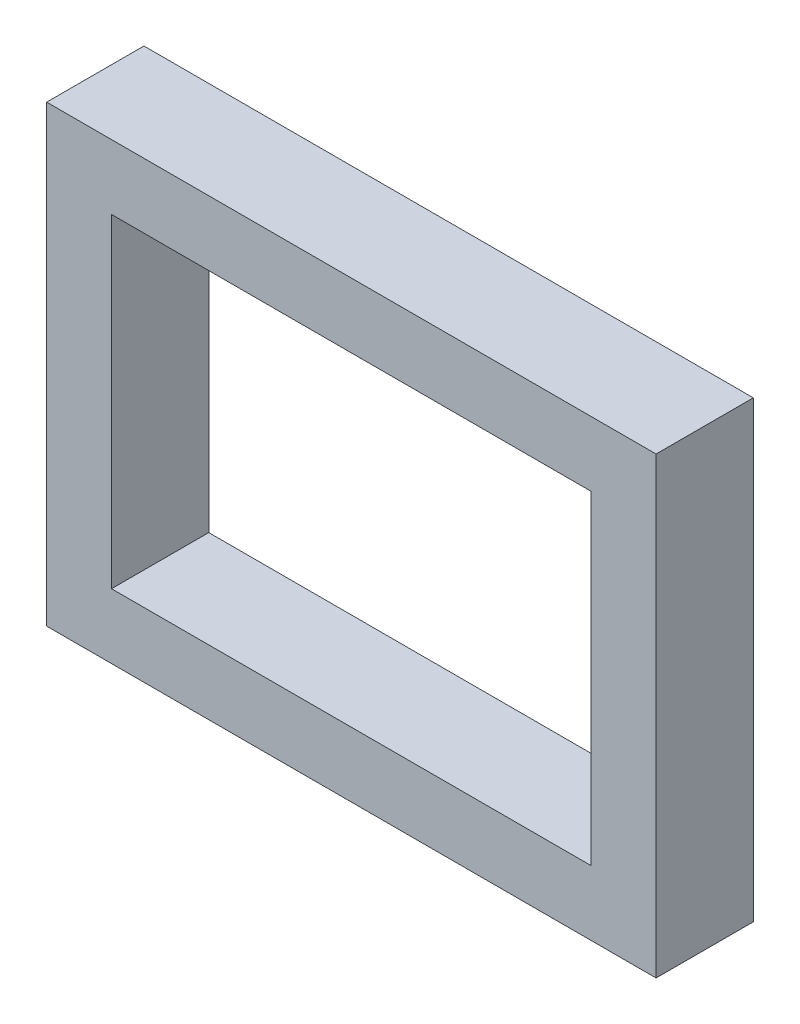
ISO-10303-21;
HEADER;
FILE_DESCRIPTION(('STEP AP214'),'2;1');
FILE_NAME('part.step','',(''),(''),'','','');
FILE_SCHEMA(('AUTOMOTIVE_DESIGN { 1 0 10303 214 1 1 1 1 }'));
ENDSEC;
DATA;
#1=APPLICATION_CONTEXT('core data for automotive mechanical design processes');
#2=APPLICATION_PROTOCOL_DEFINITION('international standard','automotive_design',2000,#1);
#3=PRODUCT_CONTEXT('',#1,'mechanical');
#4=PRODUCT('Part','Part','',(#3));
#5=PRODUCT_RELATED_PRODUCT_CATEGORY('part','',(#4));
#6=PRODUCT_DEFINITION_FORMATION('','',#4);
#7=PRODUCT_DEFINITION_CONTEXT('part definition',#1,'design');
#8=PRODUCT_DEFINITION('design','',#6,#7);
#9=PRODUCT_DEFINITION_SHAPE('','',#8);
#10=(LENGTH_UNIT() NAMED_UNIT(*) SI_UNIT(.MILLI.,.METRE.));
#11=(NAMED_UNIT(*) PLANE_ANGLE_UNIT() SI_UNIT($,.RADIAN.));
#12=(NAMED_UNIT(*) SI_UNIT($,.STERADIAN.) SOLID_ANGLE_UNIT());
#13=UNCERTAINTY_MEASURE_WITH_UNIT(LENGTH_MEASURE(1.E-05),#10,'distance_accuracy_value','');
#14=(GEOMETRIC_REPRESENTATION_CONTEXT(3) GLOBAL_UNCERTAINTY_ASSIGNED_CONTEXT((#13)) GLOBAL_UNIT_ASSIGNED_CONTEXT((#10,
#11,#12)) REPRESENTATION_CONTEXT('',''));
#15=CARTESIAN_POINT('',(0.,0.,0.));
#16=DIRECTION('',(0.,0.,1.));
#17=DIRECTION('',(1.,0.,0.));
#18=AXIS2_PLACEMENT_3D('',#15,#16,#17);
#19=CARTESIAN_POINT('',(0.,0.,9.525));
#20=DIRECTION('',(0.,0.,1.));
#21=DIRECTION('',(1.,0.,0.));
#22=AXIS2_PLACEMENT_3D('',#19,#20,#21);
#23=PLANE('',#22);
#24=DIRECTION('',(0.,1.,0.));
#25=VECTOR('',#24,1.);
#26=CARTESIAN_POINT('',(29.845,22.225,9.525));
#27=LINE('',#26,#25);
#28=CARTESIAN_POINT('',(29.845,-22.225,9.525));
#29=VERTEX_POINT('',#28);
#30=CARTESIAN_POINT('',(29.845,22.225,9.525));
#31=VERTEX_POINT('',#30);
#32=EDGE_CURVE('E159',#29,#31,#27,.T.);
#33=ORIENTED_EDGE('',*,*,#32,.T.);
#34=DIRECTION('',(-1.,0.,0.));
#35=VECTOR('',#34,1.);
#36=CARTESIAN_POINT('',(-29.845,22.225,9.525));
#37=LINE('',#36,#35);
#38=CARTESIAN_POINT('',(-29.845,22.225,9.525));
#39=VERTEX_POINT('',#38);
#40=EDGE_CURVE('E163',#31,#39,#37,.T.);
#41=ORIENTED_EDGE('',*,*,#40,.T.);
#42=DIRECTION('',(0.,-1.,0.));
#43=VECTOR('',#42,1.);
#44=CARTESIAN_POINT('',(-29.845,22.225,9.525));
#45=LINE('',#44,#43);
#46=CARTESIAN_POINT('',(-29.845,-22.225,9.525));
#47=VERTEX_POINT('',#46);
#48=EDGE_CURVE('E167',#39,#47,#45,.T.);
#49=ORIENTED_EDGE('',*,*,#48,.T.);
#50=DIRECTION('',(1.,0.,0.));
#51=VECTOR('',#50,1.);
#52=CARTESIAN_POINT('',(-29.845,-22.225,9.525));
#53=LINE('',#52,#51);
#54=EDGE_CURVE('E170',#47,#29,#53,.T.);
#55=ORIENTED_EDGE('',*,*,#54,.T.);
#56=EDGE_LOOP('',(#33,#41,#49,#55));
#57=FACE_BOUND('',#56,.T.);
#58=DIRECTION('',(1.,0.,0.));
#59=VECTOR('',#58,1.);
#60=CARTESIAN_POINT('',(-23.495,-15.875,9.525));
#61=LINE('',#60,#59);
#62=CARTESIAN_POINT('',(-23.495,-15.875,9.525));
#63=VERTEX_POINT('',#62);
#64=CARTESIAN_POINT('',(23.495,-15.875,9.525));
#65=VERTEX_POINT('',#64);
#66=EDGE_CURVE('E120',#63,#65,#61,.T.);
#67=ORIENTED_EDGE('',*,*,#66,.F.);
#68=DIRECTION('',(0.,-1.,0.));
#69=VECTOR('',#68,1.);
#70=CARTESIAN_POINT('',(-23.495,15.875,9.525));
#71=LINE('',#70,#69);
#72=CARTESIAN_POINT('',(-23.495,15.875,9.525));
#73=VERTEX_POINT('',#72);
#74=EDGE_CURVE('E111',#73,#63,#71,.T.);
#75=ORIENTED_EDGE('',*,*,#74,.F.);
#76=DIRECTION('',(-1.,0.,0.));
#77=VECTOR('',#76,1.);
#78=CARTESIAN_POINT('',(-23.495,15.875,9.525));
#79=LINE('',#78,#77);
#80=CARTESIAN_POINT('',(23.495,15.875,9.525));
#81=VERTEX_POINT('',#80);
#82=EDGE_CURVE('E137',#81,#73,#79,.T.);
#83=ORIENTED_EDGE('',*,*,#82,.F.);
#84=DIRECTION('',(0.,1.,0.));
#85=VECTOR('',#84,1.);
#86=CARTESIAN_POINT('',(23.495,15.875,9.525));
#87=LINE('',#86,#85);
#88=EDGE_CURVE('E133',#65,#81,#87,.T.);
#89=ORIENTED_EDGE('',*,*,#88,.F.);
#90=EDGE_LOOP('',(#67,#75,#83,#89));
#91=FACE_BOUND('',#90,.T.);
#92=ADVANCED_FACE('F45',(#57,#91),#23,.T.);
#93=CARTESIAN_POINT('',(0.,0.,0.));
#94=DIRECTION('',(0.,0.,1.));
#95=DIRECTION('',(1.,0.,0.));
#96=AXIS2_PLACEMENT_3D('',#93,#94,#95);
#97=PLANE('',#96);
#98=DIRECTION('',(0.,1.,0.));
#99=VECTOR('',#98,1.);
#100=CARTESIAN_POINT('',(29.845,22.225,0.));
#101=LINE('',#100,#99);
#102=CARTESIAN_POINT('',(29.845,-22.225,0.));
#103=VERTEX_POINT('',#102);
#104=CARTESIAN_POINT('',(29.845,22.225,0.));
#105=VERTEX_POINT('',#104);
#106=EDGE_CURVE('E129',#103,#105,#101,.T.);
#107=ORIENTED_EDGE('',*,*,#106,.F.);
#108=DIRECTION('',(1.,0.,0.));
#109=VECTOR('',#108,1.);
#110=CARTESIAN_POINT('',(-29.845,-22.225,0.));
#111=LINE('',#110,#109);
#112=CARTESIAN_POINT('',(-29.845,-22.225,0.));
#113=VERTEX_POINT('',#112);
#114=EDGE_CURVE('E164',#113,#103,#111,.T.);
#115=ORIENTED_EDGE('',*,*,#114,.F.);
#116=DIRECTION('',(0.,-1.,0.));
#117=VECTOR('',#116,1.);
#118=CARTESIAN_POINT('',(-29.845,22.225,0.));
#119=LINE('',#118,#117);
#120=CARTESIAN_POINT('',(-29.845,22.225,0.));
#121=VERTEX_POINT('',#120);
#122=EDGE_CURVE('E180',#121,#113,#119,.T.);
#123=ORIENTED_EDGE('',*,*,#122,.F.);
#124=DIRECTION('',(-1.,0.,0.));
#125=VECTOR('',#124,1.);
#126=CARTESIAN_POINT('',(-29.845,22.225,0.));
#127=LINE('',#126,#125);
#128=EDGE_CURVE('E177',#105,#121,#127,.T.);
#129=ORIENTED_EDGE('',*,*,#128,.F.);
#130=EDGE_LOOP('',(#107,#115,#123,#129));
#131=FACE_BOUND('',#130,.T.);
#132=DIRECTION('',(0.,-1.,0.));
#133=VECTOR('',#132,1.);
#134=CARTESIAN_POINT('',(-23.495,15.875,0.));
#135=LINE('',#134,#133);
#136=CARTESIAN_POINT('',(-23.495,15.875,0.));
#137=VERTEX_POINT('',#136);
#138=CARTESIAN_POINT('',(-23.495,-15.875,0.));
#139=VERTEX_POINT('',#138);
#140=EDGE_CURVE('E69',#137,#139,#135,.T.);
#141=ORIENTED_EDGE('',*,*,#140,.T.);
#142=DIRECTION('',(1.,0.,0.));
#143=VECTOR('',#142,1.);
#144=CARTESIAN_POINT('',(-23.495,-15.875,0.));
#145=LINE('',#144,#143);
#146=CARTESIAN_POINT('',(23.495,-15.875,0.));
#147=VERTEX_POINT('',#146);
#148=EDGE_CURVE('E127',#139,#147,#145,.T.);
#149=ORIENTED_EDGE('',*,*,#148,.T.);
#150=DIRECTION('',(0.,1.,0.));
#151=VECTOR('',#150,1.);
#152=CARTESIAN_POINT('',(23.495,15.875,0.));
#153=LINE('',#152,#151);
#154=CARTESIAN_POINT('',(23.495,15.875,0.));
#155=VERTEX_POINT('',#154);
#156=EDGE_CURVE('E146',#147,#155,#153,.T.);
#157=ORIENTED_EDGE('',*,*,#156,.T.);
#158=DIRECTION('',(-1.,0.,0.));
#159=VECTOR('',#158,1.);
#160=CARTESIAN_POINT('',(-23.495,15.875,0.));
#161=LINE('',#160,#159);
#162=EDGE_CURVE('E121',#155,#137,#161,.T.);
#163=ORIENTED_EDGE('',*,*,#162,.T.);
#164=EDGE_LOOP('',(#141,#149,#157,#163));
#165=FACE_BOUND('',#164,.T.);
#166=ADVANCED_FACE('F203',(#131,#165),#97,.F.);
#167=CARTESIAN_POINT('',(29.845,22.225,9.525));
#168=DIRECTION('',(-1.,0.,0.));
#169=DIRECTION('',(0.,-1.,0.));
#170=AXIS2_PLACEMENT_3D('',#167,#168,#169);
#171=PLANE('',#170);
#172=ORIENTED_EDGE('',*,*,#106,.T.);
#173=DIRECTION('',(0.,0.,-1.));
#174=VECTOR('',#173,1.);
#175=CARTESIAN_POINT('',(29.845,22.225,9.525));
#176=LINE('',#175,#174);
#177=EDGE_CURVE('E11',#31,#105,#176,.T.);
#178=ORIENTED_EDGE('',*,*,#177,.F.);
#179=ORIENTED_EDGE('',*,*,#32,.F.);
#180=DIRECTION('',(0.,0.,-1.));
#181=VECTOR('',#180,1.);
#182=CARTESIAN_POINT('',(29.845,-22.225,9.525));
#183=LINE('',#182,#181);
#184=EDGE_CURVE('E173',#29,#103,#183,.T.);
#185=ORIENTED_EDGE('',*,*,#184,.T.);
#186=EDGE_LOOP('',(#172,#178,#179,#185));
#187=FACE_BOUND('',#186,.T.);
#188=ADVANCED_FACE('F47',(#187),#171,.F.);
#189=CARTESIAN_POINT('',(-29.845,22.225,9.525));
#190=DIRECTION('',(0.,-1.,0.));
#191=DIRECTION('',(0.,0.,-1.));
#192=AXIS2_PLACEMENT_3D('',#189,#190,#191);
#193=PLANE('',#192);
#194=ORIENTED_EDGE('',*,*,#128,.T.);
#195=DIRECTION('',(0.,0.,-1.));
#196=VECTOR('',#195,1.);
#197=CARTESIAN_POINT('',(-29.845,22.225,9.525));
#198=LINE('',#197,#196);
#199=EDGE_CURVE('E54',#39,#121,#198,.T.);
#200=ORIENTED_EDGE('',*,*,#199,.F.);
#201=ORIENTED_EDGE('',*,*,#40,.F.);
#202=ORIENTED_EDGE('',*,*,#177,.T.);
#203=EDGE_LOOP('',(#194,#200,#201,#202));
#204=FACE_BOUND('',#203,.T.);
#205=ADVANCED_FACE('F213',(#204),#193,.F.);
#206=CARTESIAN_POINT('',(-29.845,22.225,9.525));
#207=DIRECTION('',(1.,0.,0.));
#208=DIRECTION('',(0.,1.,0.));
#209=AXIS2_PLACEMENT_3D('',#206,#207,#208);
#210=PLANE('',#209);
#211=ORIENTED_EDGE('',*,*,#122,.T.);
#212=DIRECTION('',(0.,0.,-1.));
#213=VECTOR('',#212,1.);
#214=CARTESIAN_POINT('',(-29.845,-22.225,9.525));
#215=LINE('',#214,#213);
#216=EDGE_CURVE('E188',#47,#113,#215,.T.);
#217=ORIENTED_EDGE('',*,*,#216,.F.);
#218=ORIENTED_EDGE('',*,*,#48,.F.);
#219=ORIENTED_EDGE('',*,*,#199,.T.);
#220=EDGE_LOOP('',(#211,#217,#218,#219));
#221=FACE_BOUND('',#220,.T.);
#222=ADVANCED_FACE('F197',(#221),#210,.F.);
#223=CARTESIAN_POINT('',(-29.845,-22.225,9.525));
#224=DIRECTION('',(0.,1.,0.));
#225=DIRECTION('',(0.,0.,1.));
#226=AXIS2_PLACEMENT_3D('',#223,#224,#225);
#227=PLANE('',#226);
#228=ORIENTED_EDGE('',*,*,#114,.T.);
#229=ORIENTED_EDGE('',*,*,#184,.F.);
#230=ORIENTED_EDGE('',*,*,#54,.F.);
#231=ORIENTED_EDGE('',*,*,#216,.T.);
#232=EDGE_LOOP('',(#228,#229,#230,#231));
#233=FACE_BOUND('',#232,.T.);
#234=ADVANCED_FACE('F207',(#233),#227,.F.);
#235=CARTESIAN_POINT('',(-23.495,15.875,9.525));
#236=DIRECTION('',(1.,0.,0.));
#237=DIRECTION('',(0.,1.,0.));
#238=AXIS2_PLACEMENT_3D('',#235,#236,#237);
#239=PLANE('',#238);
#240=ORIENTED_EDGE('',*,*,#140,.F.);
#241=DIRECTION('',(0.,0.,-1.));
#242=VECTOR('',#241,1.);
#243=CARTESIAN_POINT('',(-23.495,15.875,9.525));
#244=LINE('',#243,#242);
#245=EDGE_CURVE('E115',#73,#137,#244,.T.);
#246=ORIENTED_EDGE('',*,*,#245,.F.);
#247=ORIENTED_EDGE('',*,*,#74,.T.);
#248=DIRECTION('',(0.,0.,-1.));
#249=VECTOR('',#248,1.);
#250=CARTESIAN_POINT('',(-23.495,-15.875,9.525));
#251=LINE('',#250,#249);
#252=EDGE_CURVE('E114',#63,#139,#251,.T.);
#253=ORIENTED_EDGE('',*,*,#252,.T.);
#254=EDGE_LOOP('',(#240,#246,#247,#253));
#255=FACE_BOUND('',#254,.T.);
#256=ADVANCED_FACE('F113',(#255),#239,.T.);
#257=CARTESIAN_POINT('',(-23.495,-15.875,9.525));
#258=DIRECTION('',(0.,1.,0.));
#259=DIRECTION('',(0.,0.,1.));
#260=AXIS2_PLACEMENT_3D('',#257,#258,#259);
#261=PLANE('',#260);
#262=ORIENTED_EDGE('',*,*,#148,.F.);
#263=ORIENTED_EDGE('',*,*,#252,.F.);
#264=ORIENTED_EDGE('',*,*,#66,.T.);
#265=DIRECTION('',(0.,0.,-1.));
#266=VECTOR('',#265,1.);
#267=CARTESIAN_POINT('',(23.495,-15.875,9.525));
#268=LINE('',#267,#266);
#269=EDGE_CURVE('E130',#65,#147,#268,.T.);
#270=ORIENTED_EDGE('',*,*,#269,.T.);
#271=EDGE_LOOP('',(#262,#263,#264,#270));
#272=FACE_BOUND('',#271,.T.);
#273=ADVANCED_FACE('F124',(#272),#261,.T.);
#274=CARTESIAN_POINT('',(23.495,15.875,9.525));
#275=DIRECTION('',(-1.,0.,0.));
#276=DIRECTION('',(0.,-1.,0.));
#277=AXIS2_PLACEMENT_3D('',#274,#275,#276);
#278=PLANE('',#277);
#279=ORIENTED_EDGE('',*,*,#156,.F.);
#280=ORIENTED_EDGE('',*,*,#269,.F.);
#281=ORIENTED_EDGE('',*,*,#88,.T.);
#282=DIRECTION('',(0.,0.,-1.));
#283=VECTOR('',#282,1.);
#284=CARTESIAN_POINT('',(23.495,15.875,9.525));
#285=LINE('',#284,#283);
#286=EDGE_CURVE('E61',#81,#155,#285,.T.);
#287=ORIENTED_EDGE('',*,*,#286,.T.);
#288=EDGE_LOOP('',(#279,#280,#281,#287));
#289=FACE_BOUND('',#288,.T.);
#290=ADVANCED_FACE('F236',(#289),#278,.T.);
#291=CARTESIAN_POINT('',(-23.495,15.875,9.525));
#292=DIRECTION('',(0.,-1.,0.));
#293=DIRECTION('',(0.,0.,-1.));
#294=AXIS2_PLACEMENT_3D('',#291,#292,#293);
#295=PLANE('',#294);
#296=ORIENTED_EDGE('',*,*,#162,.F.);
#297=ORIENTED_EDGE('',*,*,#286,.F.);
#298=ORIENTED_EDGE('',*,*,#82,.T.);
#299=ORIENTED_EDGE('',*,*,#245,.T.);
#300=EDGE_LOOP('',(#296,#297,#298,#299));
#301=FACE_BOUND('',#300,.T.);
#302=ADVANCED_FACE('F240',(#301),#295,.T.);
#303=CLOSED_SHELL('',(#92,#166,#188,#205,#222,#234,#256,#273,#290,#302));
#304=MANIFOLD_SOLID_BREP('B2',#303);
#305=ADVANCED_BREP_SHAPE_REPRESENTATION('',(#18,#304),#14);
#306=SHAPE_DEFINITION_REPRESENTATION(#9,#305);
ENDSEC;
END-ISO-10303-21;
